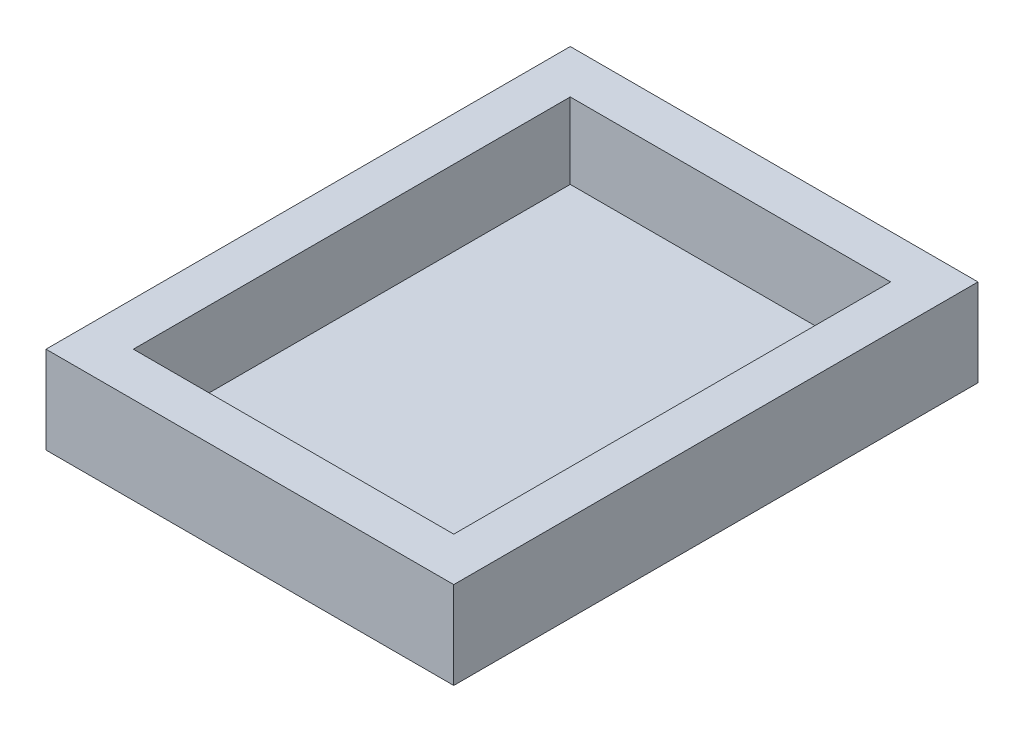
ISO-10303-21;
HEADER;
FILE_DESCRIPTION(('STEP AP214'),'2;1');
FILE_NAME('part.step','',(''),(''),'','','');
FILE_SCHEMA(('AUTOMOTIVE_DESIGN { 1 0 10303 214 1 1 1 1 }'));
ENDSEC;
DATA;
#1=APPLICATION_CONTEXT('core data for automotive mechanical design processes');
#2=APPLICATION_PROTOCOL_DEFINITION('international standard','automotive_design',2000,#1);
#3=PRODUCT_CONTEXT('',#1,'mechanical');
#4=PRODUCT('Part','Part','',(#3));
#5=PRODUCT_RELATED_PRODUCT_CATEGORY('part','',(#4));
#6=PRODUCT_DEFINITION_FORMATION('','',#4);
#7=PRODUCT_DEFINITION_CONTEXT('part definition',#1,'design');
#8=PRODUCT_DEFINITION('design','',#6,#7);
#9=PRODUCT_DEFINITION_SHAPE('','',#8);
#10=(LENGTH_UNIT() NAMED_UNIT(*) SI_UNIT(.MILLI.,.METRE.));
#11=(NAMED_UNIT(*) PLANE_ANGLE_UNIT() SI_UNIT($,.RADIAN.));
#12=(NAMED_UNIT(*) SI_UNIT($,.STERADIAN.) SOLID_ANGLE_UNIT());
#13=UNCERTAINTY_MEASURE_WITH_UNIT(LENGTH_MEASURE(1.E-05),#10,'distance_accuracy_value','');
#14=(GEOMETRIC_REPRESENTATION_CONTEXT(3) GLOBAL_UNCERTAINTY_ASSIGNED_CONTEXT((#13)) GLOBAL_UNIT_ASSIGNED_CONTEXT((#10,
#11,#12)) REPRESENTATION_CONTEXT('',''));
#15=CARTESIAN_POINT('',(0.,0.,0.));
#16=DIRECTION('',(0.,0.,1.));
#17=DIRECTION('',(1.,0.,0.));
#18=AXIS2_PLACEMENT_3D('',#15,#16,#17);
#19=CARTESIAN_POINT('',(-35.,15.,45.));
#20=DIRECTION('',(1.,0.,0.));
#21=DIRECTION('',(0.,0.,-1.));
#22=AXIS2_PLACEMENT_3D('',#19,#20,#21);
#23=PLANE('',#22);
#24=DIRECTION('',(0.,0.,1.));
#25=VECTOR('',#24,1.);
#26=CARTESIAN_POINT('',(-35.,0.,45.));
#27=LINE('',#26,#25);
#28=CARTESIAN_POINT('',(-35.,0.,-45.));
#29=VERTEX_POINT('',#28);
#30=CARTESIAN_POINT('',(-35.,0.,45.));
#31=VERTEX_POINT('',#30);
#32=EDGE_CURVE('E158',#29,#31,#27,.T.);
#33=ORIENTED_EDGE('',*,*,#32,.T.);
#34=DIRECTION('',(0.,-1.,0.));
#35=VECTOR('',#34,1.);
#36=CARTESIAN_POINT('',(-35.,15.,45.));
#37=LINE('',#36,#35);
#38=CARTESIAN_POINT('',(-35.,15.,45.));
#39=VERTEX_POINT('',#38);
#40=EDGE_CURVE('E11',#39,#31,#37,.T.);
#41=ORIENTED_EDGE('',*,*,#40,.F.);
#42=DIRECTION('',(0.,0.,1.));
#43=VECTOR('',#42,1.);
#44=CARTESIAN_POINT('',(-35.,15.,45.));
#45=LINE('',#44,#43);
#46=CARTESIAN_POINT('',(-35.,15.,-45.));
#47=VERTEX_POINT('',#46);
#48=EDGE_CURVE('E164',#47,#39,#45,.T.);
#49=ORIENTED_EDGE('',*,*,#48,.F.);
#50=DIRECTION('',(0.,-1.,0.));
#51=VECTOR('',#50,1.);
#52=CARTESIAN_POINT('',(-35.,15.,-45.));
#53=LINE('',#52,#51);
#54=EDGE_CURVE('E174',#47,#29,#53,.T.);
#55=ORIENTED_EDGE('',*,*,#54,.T.);
#56=EDGE_LOOP('',(#33,#41,#49,#55));
#57=FACE_BOUND('',#56,.T.);
#58=ADVANCED_FACE('F39',(#57),#23,.F.);
#59=CARTESIAN_POINT('',(35.,15.,45.));
#60=DIRECTION('',(0.,0.,-1.));
#61=DIRECTION('',(-1.,0.,0.));
#62=AXIS2_PLACEMENT_3D('',#59,#60,#61);
#63=PLANE('',#62);
#64=DIRECTION('',(1.,0.,0.));
#65=VECTOR('',#64,1.);
#66=CARTESIAN_POINT('',(35.,0.,45.));
#67=LINE('',#66,#65);
#68=CARTESIAN_POINT('',(35.,0.,45.));
#69=VERTEX_POINT('',#68);
#70=EDGE_CURVE('E178',#31,#69,#67,.T.);
#71=ORIENTED_EDGE('',*,*,#70,.T.);
#72=DIRECTION('',(0.,-1.,0.));
#73=VECTOR('',#72,1.);
#74=CARTESIAN_POINT('',(35.,15.,45.));
#75=LINE('',#74,#73);
#76=CARTESIAN_POINT('',(35.,15.,45.));
#77=VERTEX_POINT('',#76);
#78=EDGE_CURVE('E47',#77,#69,#75,.T.);
#79=ORIENTED_EDGE('',*,*,#78,.F.);
#80=DIRECTION('',(1.,0.,0.));
#81=VECTOR('',#80,1.);
#82=CARTESIAN_POINT('',(35.,15.,45.));
#83=LINE('',#82,#81);
#84=EDGE_CURVE('E91',#39,#77,#83,.T.);
#85=ORIENTED_EDGE('',*,*,#84,.F.);
#86=ORIENTED_EDGE('',*,*,#40,.T.);
#87=EDGE_LOOP('',(#71,#79,#85,#86));
#88=FACE_BOUND('',#87,.T.);
#89=ADVANCED_FACE('F213',(#88),#63,.F.);
#90=CARTESIAN_POINT('',(35.,15.,45.));
#91=DIRECTION('',(-1.,0.,0.));
#92=DIRECTION('',(0.,0.,1.));
#93=AXIS2_PLACEMENT_3D('',#90,#91,#92);
#94=PLANE('',#93);
#95=DIRECTION('',(0.,0.,-1.));
#96=VECTOR('',#95,1.);
#97=CARTESIAN_POINT('',(35.,0.,45.));
#98=LINE('',#97,#96);
#99=CARTESIAN_POINT('',(35.,0.,-45.));
#100=VERTEX_POINT('',#99);
#101=EDGE_CURVE('E181',#69,#100,#98,.T.);
#102=ORIENTED_EDGE('',*,*,#101,.T.);
#103=DIRECTION('',(0.,-1.,0.));
#104=VECTOR('',#103,1.);
#105=CARTESIAN_POINT('',(35.,15.,-45.));
#106=LINE('',#105,#104);
#107=CARTESIAN_POINT('',(35.,15.,-45.));
#108=VERTEX_POINT('',#107);
#109=EDGE_CURVE('E188',#108,#100,#106,.T.);
#110=ORIENTED_EDGE('',*,*,#109,.F.);
#111=DIRECTION('',(0.,0.,-1.));
#112=VECTOR('',#111,1.);
#113=CARTESIAN_POINT('',(35.,15.,45.));
#114=LINE('',#113,#112);
#115=EDGE_CURVE('E169',#77,#108,#114,.T.);
#116=ORIENTED_EDGE('',*,*,#115,.F.);
#117=ORIENTED_EDGE('',*,*,#78,.T.);
#118=EDGE_LOOP('',(#102,#110,#116,#117));
#119=FACE_BOUND('',#118,.T.);
#120=ADVANCED_FACE('F195',(#119),#94,.F.);
#121=CARTESIAN_POINT('',(35.,15.,-45.));
#122=DIRECTION('',(0.,0.,1.));
#123=DIRECTION('',(1.,0.,0.));
#124=AXIS2_PLACEMENT_3D('',#121,#122,#123);
#125=PLANE('',#124);
#126=DIRECTION('',(-1.,0.,0.));
#127=VECTOR('',#126,1.);
#128=CARTESIAN_POINT('',(35.,0.,-45.));
#129=LINE('',#128,#127);
#130=EDGE_CURVE('E84',#100,#29,#129,.T.);
#131=ORIENTED_EDGE('',*,*,#130,.T.);
#132=ORIENTED_EDGE('',*,*,#54,.F.);
#133=DIRECTION('',(-1.,0.,0.));
#134=VECTOR('',#133,1.);
#135=CARTESIAN_POINT('',(35.,15.,-45.));
#136=LINE('',#135,#134);
#137=EDGE_CURVE('E63',#108,#47,#136,.T.);
#138=ORIENTED_EDGE('',*,*,#137,.F.);
#139=ORIENTED_EDGE('',*,*,#109,.T.);
#140=EDGE_LOOP('',(#131,#132,#138,#139));
#141=FACE_BOUND('',#140,.T.);
#142=ADVANCED_FACE('F203',(#141),#125,.F.);
#143=CARTESIAN_POINT('',(0.,15.,0.));
#144=DIRECTION('',(0.,1.,0.));
#145=DIRECTION('',(0.,0.,1.));
#146=AXIS2_PLACEMENT_3D('',#143,#144,#145);
#147=PLANE('',#146);
#148=DIRECTION('',(0.,0.,1.));
#149=VECTOR('',#148,1.);
#150=CARTESIAN_POINT('',(-27.5,15.,37.5));
#151=LINE('',#150,#149);
#152=CARTESIAN_POINT('',(-27.5,15.,-37.5));
#153=VERTEX_POINT('',#152);
#154=CARTESIAN_POINT('',(-27.5,15.,37.5));
#155=VERTEX_POINT('',#154);
#156=EDGE_CURVE('E54',#153,#155,#151,.T.);
#157=ORIENTED_EDGE('',*,*,#156,.F.);
#158=DIRECTION('',(-1.,0.,0.));
#159=VECTOR('',#158,1.);
#160=CARTESIAN_POINT('',(27.5,15.,-37.5));
#161=LINE('',#160,#159);
#162=CARTESIAN_POINT('',(27.5,15.,-37.5));
#163=VERTEX_POINT('',#162);
#164=EDGE_CURVE('E136',#163,#153,#161,.T.);
#165=ORIENTED_EDGE('',*,*,#164,.F.);
#166=DIRECTION('',(0.,0.,-1.));
#167=VECTOR('',#166,1.);
#168=CARTESIAN_POINT('',(27.5,15.,37.5));
#169=LINE('',#168,#167);
#170=CARTESIAN_POINT('',(27.5,15.,37.5));
#171=VERTEX_POINT('',#170);
#172=EDGE_CURVE('E140',#171,#163,#169,.T.);
#173=ORIENTED_EDGE('',*,*,#172,.F.);
#174=DIRECTION('',(1.,0.,0.));
#175=VECTOR('',#174,1.);
#176=CARTESIAN_POINT('',(27.5,15.,37.5));
#177=LINE('',#176,#175);
#178=EDGE_CURVE('E149',#155,#171,#177,.T.);
#179=ORIENTED_EDGE('',*,*,#178,.F.);
#180=EDGE_LOOP('',(#157,#165,#173,#179));
#181=FACE_BOUND('',#180,.T.);
#182=ORIENTED_EDGE('',*,*,#48,.T.);
#183=ORIENTED_EDGE('',*,*,#84,.T.);
#184=ORIENTED_EDGE('',*,*,#115,.T.);
#185=ORIENTED_EDGE('',*,*,#137,.T.);
#186=EDGE_LOOP('',(#182,#183,#184,#185));
#187=FACE_BOUND('',#186,.T.);
#188=ADVANCED_FACE('F205',(#181,#187),#147,.T.);
#189=CARTESIAN_POINT('',(0.,0.,0.));
#190=DIRECTION('',(0.,1.,0.));
#191=DIRECTION('',(0.,0.,1.));
#192=AXIS2_PLACEMENT_3D('',#189,#190,#191);
#193=PLANE('',#192);
#194=ORIENTED_EDGE('',*,*,#32,.F.);
#195=ORIENTED_EDGE('',*,*,#130,.F.);
#196=ORIENTED_EDGE('',*,*,#101,.F.);
#197=ORIENTED_EDGE('',*,*,#70,.F.);
#198=EDGE_LOOP('',(#194,#195,#196,#197));
#199=FACE_BOUND('',#198,.T.);
#200=ADVANCED_FACE('F199',(#199),#193,.F.);
#201=CARTESIAN_POINT('',(-27.5,2.,37.5));
#202=DIRECTION('',(-1.,0.,0.));
#203=DIRECTION('',(0.,0.,1.));
#204=AXIS2_PLACEMENT_3D('',#201,#202,#203);
#205=PLANE('',#204);
#206=ORIENTED_EDGE('',*,*,#156,.T.);
#207=DIRECTION('',(0.,1.,0.));
#208=VECTOR('',#207,1.);
#209=CARTESIAN_POINT('',(-27.5,2.,37.5));
#210=LINE('',#209,#208);
#211=CARTESIAN_POINT('',(-27.5,2.,37.5));
#212=VERTEX_POINT('',#211);
#213=EDGE_CURVE('E111',#212,#155,#210,.T.);
#214=ORIENTED_EDGE('',*,*,#213,.F.);
#215=DIRECTION('',(0.,0.,1.));
#216=VECTOR('',#215,1.);
#217=CARTESIAN_POINT('',(-27.5,2.,37.5));
#218=LINE('',#217,#216);
#219=CARTESIAN_POINT('',(-27.5,2.,-37.5));
#220=VERTEX_POINT('',#219);
#221=EDGE_CURVE('E115',#220,#212,#218,.T.);
#222=ORIENTED_EDGE('',*,*,#221,.F.);
#223=DIRECTION('',(0.,1.,0.));
#224=VECTOR('',#223,1.);
#225=CARTESIAN_POINT('',(-27.5,2.,-37.5));
#226=LINE('',#225,#224);
#227=EDGE_CURVE('E155',#220,#153,#226,.T.);
#228=ORIENTED_EDGE('',*,*,#227,.T.);
#229=EDGE_LOOP('',(#206,#214,#222,#228));
#230=FACE_BOUND('',#229,.T.);
#231=ADVANCED_FACE('F113',(#230),#205,.F.);
#232=CARTESIAN_POINT('',(27.5,2.,-37.5));
#233=DIRECTION('',(0.,0.,-1.));
#234=DIRECTION('',(-1.,0.,0.));
#235=AXIS2_PLACEMENT_3D('',#232,#233,#234);
#236=PLANE('',#235);
#237=ORIENTED_EDGE('',*,*,#164,.T.);
#238=ORIENTED_EDGE('',*,*,#227,.F.);
#239=DIRECTION('',(-1.,0.,0.));
#240=VECTOR('',#239,1.);
#241=CARTESIAN_POINT('',(27.5,2.,-37.5));
#242=LINE('',#241,#240);
#243=CARTESIAN_POINT('',(27.5,2.,-37.5));
#244=VERTEX_POINT('',#243);
#245=EDGE_CURVE('E122',#244,#220,#242,.T.);
#246=ORIENTED_EDGE('',*,*,#245,.F.);
#247=DIRECTION('',(0.,1.,0.));
#248=VECTOR('',#247,1.);
#249=CARTESIAN_POINT('',(27.5,2.,-37.5));
#250=LINE('',#249,#248);
#251=EDGE_CURVE('E159',#244,#163,#250,.T.);
#252=ORIENTED_EDGE('',*,*,#251,.T.);
#253=EDGE_LOOP('',(#237,#238,#246,#252));
#254=FACE_BOUND('',#253,.T.);
#255=ADVANCED_FACE('F252',(#254),#236,.F.);
#256=CARTESIAN_POINT('',(27.5,2.,37.5));
#257=DIRECTION('',(1.,0.,0.));
#258=DIRECTION('',(0.,0.,-1.));
#259=AXIS2_PLACEMENT_3D('',#256,#257,#258);
#260=PLANE('',#259);
#261=ORIENTED_EDGE('',*,*,#172,.T.);
#262=ORIENTED_EDGE('',*,*,#251,.F.);
#263=DIRECTION('',(0.,0.,-1.));
#264=VECTOR('',#263,1.);
#265=CARTESIAN_POINT('',(27.5,2.,37.5));
#266=LINE('',#265,#264);
#267=CARTESIAN_POINT('',(27.5,2.,37.5));
#268=VERTEX_POINT('',#267);
#269=EDGE_CURVE('E131',#268,#244,#266,.T.);
#270=ORIENTED_EDGE('',*,*,#269,.F.);
#271=DIRECTION('',(0.,1.,0.));
#272=VECTOR('',#271,1.);
#273=CARTESIAN_POINT('',(27.5,2.,37.5));
#274=LINE('',#273,#272);
#275=EDGE_CURVE('E121',#268,#171,#274,.T.);
#276=ORIENTED_EDGE('',*,*,#275,.T.);
#277=EDGE_LOOP('',(#261,#262,#270,#276));
#278=FACE_BOUND('',#277,.T.);
#279=ADVANCED_FACE('F261',(#278),#260,.F.);
#280=CARTESIAN_POINT('',(27.5,2.,37.5));
#281=DIRECTION('',(0.,0.,1.));
#282=DIRECTION('',(1.,0.,0.));
#283=AXIS2_PLACEMENT_3D('',#280,#281,#282);
#284=PLANE('',#283);
#285=ORIENTED_EDGE('',*,*,#178,.T.);
#286=ORIENTED_EDGE('',*,*,#275,.F.);
#287=DIRECTION('',(1.,0.,0.));
#288=VECTOR('',#287,1.);
#289=CARTESIAN_POINT('',(27.5,2.,37.5));
#290=LINE('',#289,#288);
#291=EDGE_CURVE('E125',#212,#268,#290,.T.);
#292=ORIENTED_EDGE('',*,*,#291,.F.);
#293=ORIENTED_EDGE('',*,*,#213,.T.);
#294=EDGE_LOOP('',(#285,#286,#292,#293));
#295=FACE_BOUND('',#294,.T.);
#296=ADVANCED_FACE('F126',(#295),#284,.F.);
#297=CARTESIAN_POINT('',(0.,2.,0.));
#298=DIRECTION('',(0.,1.,0.));
#299=DIRECTION('',(0.,0.,1.));
#300=AXIS2_PLACEMENT_3D('',#297,#298,#299);
#301=PLANE('',#300);
#302=ORIENTED_EDGE('',*,*,#221,.T.);
#303=ORIENTED_EDGE('',*,*,#291,.T.);
#304=ORIENTED_EDGE('',*,*,#269,.T.);
#305=ORIENTED_EDGE('',*,*,#245,.T.);
#306=EDGE_LOOP('',(#302,#303,#304,#305));
#307=FACE_BOUND('',#306,.T.);
#308=ADVANCED_FACE('F133',(#307),#301,.T.);
#309=CLOSED_SHELL('',(#58,#89,#120,#142,#188,#200,#231,#255,#279,#296,#308));
#310=MANIFOLD_SOLID_BREP('B2',#309);
#311=ADVANCED_BREP_SHAPE_REPRESENTATION('',(#18,#310),#14);
#312=SHAPE_DEFINITION_REPRESENTATION(#9,#311);
ENDSEC;
END-ISO-10303-21;
